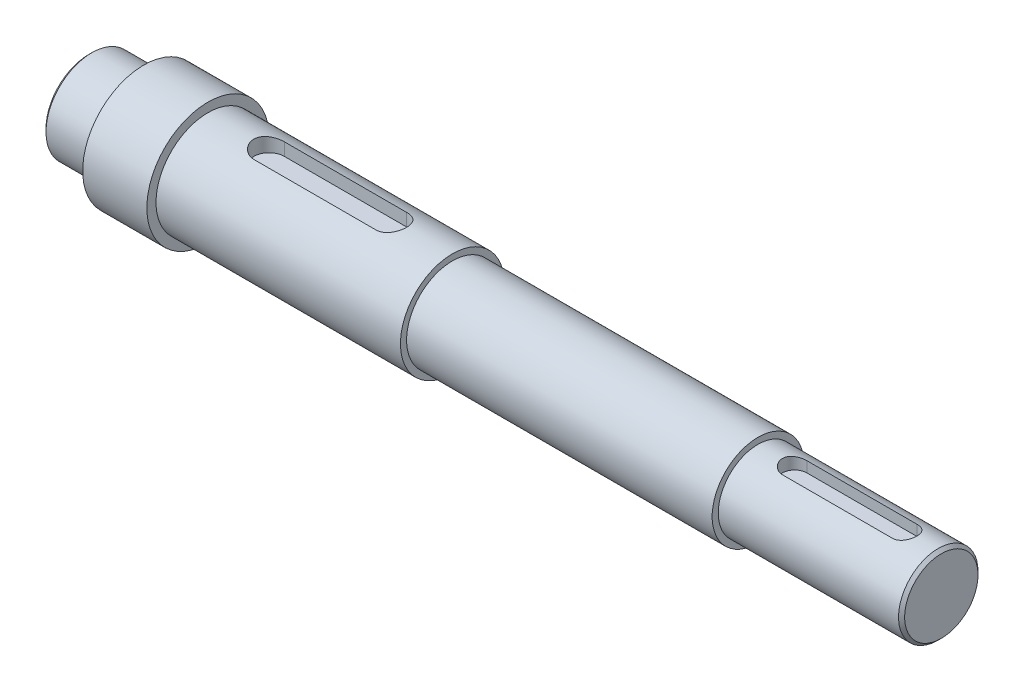
ISO-10303-21;
HEADER;
FILE_DESCRIPTION(('STEP AP214'),'2;1');
FILE_NAME('part.step','',(''),(''),'','','');
FILE_SCHEMA(('AUTOMOTIVE_DESIGN { 1 0 10303 214 1 1 1 1 }'));
ENDSEC;
DATA;
#1=APPLICATION_CONTEXT('core data for automotive mechanical design processes');
#2=APPLICATION_PROTOCOL_DEFINITION('international standard','automotive_design',2000,#1);
#3=PRODUCT_CONTEXT('',#1,'mechanical');
#4=PRODUCT('Part','Part','',(#3));
#5=PRODUCT_RELATED_PRODUCT_CATEGORY('part','',(#4));
#6=PRODUCT_DEFINITION_FORMATION('','',#4);
#7=PRODUCT_DEFINITION_CONTEXT('part definition',#1,'design');
#8=PRODUCT_DEFINITION('design','',#6,#7);
#9=PRODUCT_DEFINITION_SHAPE('','',#8);
#10=(LENGTH_UNIT() NAMED_UNIT(*) SI_UNIT(.MILLI.,.METRE.));
#11=(NAMED_UNIT(*) PLANE_ANGLE_UNIT() SI_UNIT($,.RADIAN.));
#12=(NAMED_UNIT(*) SI_UNIT($,.STERADIAN.) SOLID_ANGLE_UNIT());
#13=UNCERTAINTY_MEASURE_WITH_UNIT(LENGTH_MEASURE(1.E-05),#10,'distance_accuracy_value','');
#14=(GEOMETRIC_REPRESENTATION_CONTEXT(3) GLOBAL_UNCERTAINTY_ASSIGNED_CONTEXT((#13)) GLOBAL_UNIT_ASSIGNED_CONTEXT((#10,
#11,#12)) REPRESENTATION_CONTEXT('',''));
#15=CARTESIAN_POINT('',(0.,0.,0.));
#16=DIRECTION('',(0.,0.,1.));
#17=DIRECTION('',(1.,0.,0.));
#18=AXIS2_PLACEMENT_3D('',#15,#16,#17);
#19=CARTESIAN_POINT('',(-40.,0.,0.));
#20=DIRECTION('',(1.,0.,0.));
#21=DIRECTION('',(0.,0.,-1.));
#22=AXIS2_PLACEMENT_3D('',#19,#20,#21);
#23=CYLINDRICAL_SURFACE('',#22,17.);
#24=CARTESIAN_POINT('',(20.,16.2480768092719,4.99999999999999));
#25=CARTESIAN_POINT('',(20.1373573551922,16.2480576057113,5.00001833365599));
#26=CARTESIAN_POINT('',(20.2747075137782,16.2498179552306,4.99434067750169));
#27=CARTESIAN_POINT('',(20.5483622843304,16.2567574396778,4.97172956757708));
#28=CARTESIAN_POINT('',(20.6846671171852,16.2619358310066,4.9547985619809));
#29=CARTESIAN_POINT('',(20.954927984574,16.2755544258761,4.9098721345541));
#30=CARTESIAN_POINT('',(21.08888897085,16.2839865768408,4.88190402408557));
#31=CARTESIAN_POINT('',(21.35386058697,16.303848966742,4.81515607667776));
#32=CARTESIAN_POINT('',(21.4848711443316,16.3152792792465,4.77637597443613));
#33=CARTESIAN_POINT('',(21.7429838808258,16.3407928675336,4.68834546623764));
#34=CARTESIAN_POINT('',(21.8700881832774,16.35487467128,4.639100867945));
#35=CARTESIAN_POINT('',(22.1196497111169,16.3852842844182,4.53052243699424));
#36=CARTESIAN_POINT('',(22.2421051873766,16.4016129287079,4.47118485196363));
#37=CARTESIAN_POINT('',(22.6013177842668,16.4532935993227,4.27864731243666));
#38=CARTESIAN_POINT('',(22.8300782555896,16.4913567660558,4.13086866840748));
#39=CARTESIAN_POINT('',(23.2660976925366,16.571663624385,3.79609162419459));
#40=CARTESIAN_POINT('',(23.4725969054199,16.6139932162939,3.6081305850655));
#41=CARTESIAN_POINT('',(23.8516884654868,16.6973435357355,3.20030857492808));
#42=CARTESIAN_POINT('',(24.024275129355,16.738364042919,2.98044226771472));
#43=CARTESIAN_POINT('',(24.3338634908734,16.8154504865609,2.50968968461801));
#44=CARTESIAN_POINT('',(24.4700927618875,16.8514022123902,2.25827531326124));
#45=CARTESIAN_POINT('',(24.6980429387671,16.9132940292114,1.73487980523033));
#46=CARTESIAN_POINT('',(24.7897749729991,16.9392366230664,1.46290383051912));
#47=CARTESIAN_POINT('',(24.9236255034259,16.9775755314304,0.914050811145533));
#48=CARTESIAN_POINT('',(24.967041360291,16.9903253914832,0.637515280561356));
#49=CARTESIAN_POINT('',(25.0071261054816,17.002085771092,0.0808045490202934));
#50=CARTESIAN_POINT('',(25.0038034661687,17.0010987807491,-0.1993699830897));
#51=CARTESIAN_POINT('',(24.9513847320661,16.9857482177916,-0.746303613122903));
#52=CARTESIAN_POINT('',(24.9036937216598,16.971795274301,-1.01321077293713));
#53=CARTESIAN_POINT('',(24.7661741598714,16.9325753120472,-1.53505435338395));
#54=CARTESIAN_POINT('',(24.67634343216,16.9073077089352,-1.78999015500089));
#55=CARTESIAN_POINT('',(24.4561536556856,16.8477289854582,-2.28401372569565));
#56=CARTESIAN_POINT('',(24.3253453943821,16.8133183027333,-2.52288833489009));
#57=CARTESIAN_POINT('',(24.0271392111166,16.7390884536049,-2.97583887126396));
#58=CARTESIAN_POINT('',(23.8597334078597,16.6992681229319,-3.18990944166786));
#59=CARTESIAN_POINT('',(23.5812358030133,16.6378075752149,-3.4920659168818));
#60=CARTESIAN_POINT('',(23.4817831564547,16.6166346371931,-3.59122666935948));
#61=CARTESIAN_POINT('',(23.2748783834456,16.574515917753,-3.78085070777116));
#62=CARTESIAN_POINT('',(23.1674290232921,16.5535700606271,-3.87131697679482));
#63=CARTESIAN_POINT('',(22.945133981091,16.5124763694782,-4.04301012905334));
#64=CARTESIAN_POINT('',(22.8302833662414,16.4923290824383,-4.12423074837306));
#65=CARTESIAN_POINT('',(22.5940231238164,16.4534309011257,-4.27677509066324));
#66=CARTESIAN_POINT('',(22.4726160769662,16.4346794642359,-4.34810266882159));
#67=CARTESIAN_POINT('',(22.222763974027,16.3989403852824,-4.48102005705394));
#68=CARTESIAN_POINT('',(22.0942612508792,16.3819719919192,-4.5425067371777));
#69=CARTESIAN_POINT('',(21.8322669374845,16.3505443123856,-4.65436101170345));
#70=CARTESIAN_POINT('',(21.6987774077231,16.3360840035426,-4.70473314035983));
#71=CARTESIAN_POINT('',(21.427861366181,16.3101389019193,-4.79390518315269));
#72=CARTESIAN_POINT('',(21.290439153234,16.2986509883397,-4.83271724105078));
#73=CARTESIAN_POINT('',(21.0126074426436,16.2790104320994,-4.89846852342729));
#74=CARTESIAN_POINT('',(20.872199356913,16.2708562483744,-4.9254132342024));
#75=CARTESIAN_POINT('',(20.6098794624432,16.2590705066644,-4.96417068240111));
#76=CARTESIAN_POINT('',(20.488226619312,16.2549556983354,-4.97760735163162));
#77=CARTESIAN_POINT('',(20.2443856622037,16.2494550949357,-4.99552050263312));
#78=CARTESIAN_POINT('',(20.1221986228068,16.2480652217765,-5.00001037418403));
#79=CARTESIAN_POINT('',(20.,16.2480768092719,-5.00000000000001));
#80=B_SPLINE_CURVE_WITH_KNOTS('',3,(#24,#25,#26,#27,#28,#29,#30,#31,#32,#33,#34,#35,#36,#37,#38,
#39,#40,#41,#42,#43,#44,#45,#46,#47,#48,#49,#50,#51,#52,#53,#54,#55,#56,#57,#58,#59,#60,#61,#62,
#63,#64,#65,#66,#67,#68,#69,#70,#71,#72,#73,#74,#75,#76,#77,#78,#79),.UNSPECIFIED.,.F.,.F.,(4,2,
2,2,2,2,2,2,2,2,2,2,2,2,2,2,2,2,2,2,2,2,2,2,2,2,2,4),(0.,0.411932308607318,0.823775030369109,
1.23460497227756,1.6454449959308,2.05605760124987,2.4668231992094,3.28785949768654,
4.13136486159802,4.97501146602548,5.8353659212397,6.69550509831942,7.53194488257935,
8.36823304602236,9.17890704625409,9.98962291880722,10.8095570219776,11.6296678725158,
12.0553444367381,12.4808744253904,12.9066910154504,13.3323412013584,13.762195215061,
14.1918735414273,14.6210988891539,15.0501255963828,15.4171594657276,15.7836436182818),.UNSPECIFIED.);
#81=CARTESIAN_POINT('',(20.,16.2480768092719,4.99999999999999));
#82=VERTEX_POINT('',#81);
#83=CARTESIAN_POINT('',(20.,16.2480768092719,-5.00000000000001));
#84=VERTEX_POINT('',#83);
#85=EDGE_CURVE('E181',#82,#84,#80,.T.);
#86=ORIENTED_EDGE('',*,*,#85,.F.);
#87=DIRECTION('',(1.,0.,0.));
#88=VECTOR('',#87,1.);
#89=CARTESIAN_POINT('',(-40.,16.2480768092719,5.));
#90=LINE('',#89,#88);
#91=CARTESIAN_POINT('',(-20.,16.2480768092719,5.));
#92=VERTEX_POINT('',#91);
#93=EDGE_CURVE('E149',#92,#82,#90,.T.);
#94=ORIENTED_EDGE('',*,*,#93,.F.);
#95=CARTESIAN_POINT('',(-20.,16.2480768092719,-5.));
#96=CARTESIAN_POINT('',(-20.1373573551922,16.2480576057113,-5.00001833365599));
#97=CARTESIAN_POINT('',(-20.2747075137782,16.2498179552306,-4.9943406775017));
#98=CARTESIAN_POINT('',(-20.5483622843304,16.2567574396778,-4.97172956757709));
#99=CARTESIAN_POINT('',(-20.6846671171852,16.2619358310066,-4.95479856198091));
#100=CARTESIAN_POINT('',(-20.954927984574,16.2755544258761,-4.9098721345541));
#101=CARTESIAN_POINT('',(-21.08888897085,16.2839865768408,-4.88190402408558));
#102=CARTESIAN_POINT('',(-21.35386058697,16.303848966742,-4.81515607667777));
#103=CARTESIAN_POINT('',(-21.4848711443316,16.3152792792465,-4.77637597443613));
#104=CARTESIAN_POINT('',(-21.7429838808258,16.3407928675336,-4.68834546623764));
#105=CARTESIAN_POINT('',(-21.8700881832774,16.35487467128,-4.63910086794501));
#106=CARTESIAN_POINT('',(-22.1196497111169,16.3852842844182,-4.53052243699425));
#107=CARTESIAN_POINT('',(-22.2421051873766,16.4016129287079,-4.47118485196364));
#108=CARTESIAN_POINT('',(-22.6013177842668,16.4532935993227,-4.27864731243667));
#109=CARTESIAN_POINT('',(-22.8300782555896,16.4913567660558,-4.13086866840748));
#110=CARTESIAN_POINT('',(-23.2660976925366,16.571663624385,-3.7960916241946));
#111=CARTESIAN_POINT('',(-23.4725969054199,16.6139932162939,-3.60813058506551));
#112=CARTESIAN_POINT('',(-23.8516884654868,16.6973435357355,-3.20030857492808));
#113=CARTESIAN_POINT('',(-24.0242751293551,16.738364042919,-2.98044226771472));
#114=CARTESIAN_POINT('',(-24.3338634908734,16.8154504865609,-2.50968968461802));
#115=CARTESIAN_POINT('',(-24.4700927618875,16.8514022123902,-2.25827531326124));
#116=CARTESIAN_POINT('',(-24.6980429387671,16.9132940292114,-1.73487980523033));
#117=CARTESIAN_POINT('',(-24.7897749729991,16.9392366230664,-1.46290383051912));
#118=CARTESIAN_POINT('',(-24.9236255034259,16.9775755314304,-0.914050811145538));
#119=CARTESIAN_POINT('',(-24.967041360291,16.9903253914832,-0.637515280561361));
#120=CARTESIAN_POINT('',(-25.0071261054816,17.002085771092,-0.0808045490202978));
#121=CARTESIAN_POINT('',(-25.0038034661687,17.0010987807491,0.199369983089696));
#122=CARTESIAN_POINT('',(-24.9513847320661,16.9857482177916,0.746303613122898));
#123=CARTESIAN_POINT('',(-24.9036937216598,16.971795274301,1.01321077293712));
#124=CARTESIAN_POINT('',(-24.7661741598714,16.9325753120472,1.53505435338394));
#125=CARTESIAN_POINT('',(-24.67634343216,16.9073077089352,1.78999015500089));
#126=CARTESIAN_POINT('',(-24.4561536556856,16.8477289854582,2.28401372569564));
#127=CARTESIAN_POINT('',(-24.3253453943821,16.8133183027333,2.52288833489009));
#128=CARTESIAN_POINT('',(-24.0271392111166,16.7390884536049,2.97583887126396));
#129=CARTESIAN_POINT('',(-23.8597334078597,16.6992681229319,3.18990944166786));
#130=CARTESIAN_POINT('',(-23.5812358030132,16.6378075752149,3.49206591688179));
#131=CARTESIAN_POINT('',(-23.4817831564547,16.6166346371931,3.59122666935947));
#132=CARTESIAN_POINT('',(-23.2748783834456,16.574515917753,3.78085070777115));
#133=CARTESIAN_POINT('',(-23.1674290232921,16.5535700606271,3.87131697679481));
#134=CARTESIAN_POINT('',(-22.945133981091,16.5124763694782,4.04301012905334));
#135=CARTESIAN_POINT('',(-22.8302833662414,16.4923290824383,4.12423074837306));
#136=CARTESIAN_POINT('',(-22.5940231238164,16.4534309011257,4.27677509066323));
#137=CARTESIAN_POINT('',(-22.4726160769662,16.4346794642359,4.34810266882159));
#138=CARTESIAN_POINT('',(-22.222763974027,16.3989403852824,4.48102005705394));
#139=CARTESIAN_POINT('',(-22.0942612508792,16.3819719919192,4.54250673717769));
#140=CARTESIAN_POINT('',(-21.8322669374845,16.3505443123856,4.65436101170344));
#141=CARTESIAN_POINT('',(-21.6987774077231,16.3360840035426,4.70473314035982));
#142=CARTESIAN_POINT('',(-21.427861366181,16.3101389019193,4.79390518315268));
#143=CARTESIAN_POINT('',(-21.290439153234,16.2986509883397,4.83271724105077));
#144=CARTESIAN_POINT('',(-21.0126074426436,16.2790104320994,4.89846852342728));
#145=CARTESIAN_POINT('',(-20.872199356913,16.2708562483745,4.92541323420239));
#146=CARTESIAN_POINT('',(-20.6098794624432,16.2590705066644,4.9641706824011));
#147=CARTESIAN_POINT('',(-20.488226619312,16.2549556983354,4.97760735163161));
#148=CARTESIAN_POINT('',(-20.2443856622037,16.2494550949357,4.99552050263311));
#149=CARTESIAN_POINT('',(-20.1221986228068,16.2480652217765,5.00001037418402));
#150=CARTESIAN_POINT('',(-20.,16.2480768092719,5.));
#151=B_SPLINE_CURVE_WITH_KNOTS('',3,(#95,#96,#97,#98,#99,#100,#101,#102,#103,#104,#105,#106,
#107,#108,#109,#110,#111,#112,#113,#114,#115,#116,#117,#118,#119,#120,#121,#122,#123,#124,#125,
#126,#127,#128,#129,#130,#131,#132,#133,#134,#135,#136,#137,#138,#139,#140,#141,#142,#143,#144,
#145,#146,#147,#148,#149,#150),.UNSPECIFIED.,.F.,.F.,(4,2,2,2,2,2,2,2,2,2,2,2,2,2,2,2,2,2,2,2,2,
2,2,2,2,2,2,4),(0.,0.411932308607318,0.82377503036911,1.23460497227756,1.6454449959308,
2.05605760124987,2.4668231992094,3.28785949768654,4.13136486159803,4.97501146602548,
5.8353659212397,6.69550509831943,7.53194488257935,8.36823304602237,9.17890704625409,
9.98962291880722,10.8095570219776,11.6296678725158,12.0553444367381,12.4808744253904,
12.9066910154504,13.3323412013584,13.762195215061,14.1918735414273,14.6210988891539,
15.0501255963828,15.4171594657276,15.7836436182818),.UNSPECIFIED.);
#152=CARTESIAN_POINT('',(-20.,16.2480768092719,-5.));
#153=VERTEX_POINT('',#152);
#154=EDGE_CURVE('E212',#153,#92,#151,.T.);
#155=ORIENTED_EDGE('',*,*,#154,.F.);
#156=DIRECTION('',(1.,0.,0.));
#157=VECTOR('',#156,1.);
#158=CARTESIAN_POINT('',(-40.,16.2480768092719,-5.));
#159=LINE('',#158,#157);
#160=EDGE_CURVE('E191',#84,#153,#159,.F.);
#161=ORIENTED_EDGE('',*,*,#160,.F.);
#162=EDGE_LOOP('',(#86,#94,#155,#161));
#163=FACE_BOUND('',#162,.T.);
#164=CARTESIAN_POINT('',(-40.,0.,0.));
#165=DIRECTION('',(1.,0.,0.));
#166=DIRECTION('',(0.,0.,-1.));
#167=AXIS2_PLACEMENT_3D('',#164,#165,#166);
#168=CIRCLE('',#167,17.);
#169=CARTESIAN_POINT('',(-40.,0.,-17.));
#170=VERTEX_POINT('',#169);
#171=EDGE_CURVE('E153',#170,#170,#168,.T.);
#172=ORIENTED_EDGE('',*,*,#171,.T.);
#173=EDGE_LOOP('',(#172));
#174=FACE_BOUND('',#173,.T.);
#175=CARTESIAN_POINT('',(40.,0.,0.));
#176=DIRECTION('',(1.,0.,0.));
#177=DIRECTION('',(0.,0.,-1.));
#178=AXIS2_PLACEMENT_3D('',#175,#176,#177);
#179=CIRCLE('',#178,17.);
#180=CARTESIAN_POINT('',(40.,0.,-17.));
#181=VERTEX_POINT('',#180);
#182=EDGE_CURVE('E171',#181,#181,#179,.T.);
#183=ORIENTED_EDGE('',*,*,#182,.F.);
#184=EDGE_LOOP('',(#183));
#185=FACE_BOUND('',#184,.T.);
#186=ADVANCED_FACE('F36',(#163,#174,#185),#23,.T.);
#187=CARTESIAN_POINT('',(40.,0.,0.));
#188=DIRECTION('',(1.,0.,0.));
#189=DIRECTION('',(0.,0.,-1.));
#190=AXIS2_PLACEMENT_3D('',#187,#188,#189);
#191=PLANE('',#190);
#192=CARTESIAN_POINT('',(40.,0.,0.));
#193=DIRECTION('',(1.,0.,0.));
#194=DIRECTION('',(0.,0.,-1.));
#195=AXIS2_PLACEMENT_3D('',#192,#193,#194);
#196=CIRCLE('',#195,15.);
#197=CARTESIAN_POINT('',(40.,0.,-15.));
#198=VERTEX_POINT('',#197);
#199=EDGE_CURVE('E138',#198,#198,#196,.T.);
#200=ORIENTED_EDGE('',*,*,#199,.F.);
#201=EDGE_LOOP('',(#200));
#202=FACE_BOUND('',#201,.T.);
#203=ORIENTED_EDGE('',*,*,#182,.T.);
#204=EDGE_LOOP('',(#203));
#205=FACE_BOUND('',#204,.T.);
#206=ADVANCED_FACE('F210',(#202,#205),#191,.T.);
#207=CARTESIAN_POINT('',(-20.,12.1,0.));
#208=DIRECTION('',(0.,1.,0.));
#209=DIRECTION('',(0.,0.,1.));
#210=AXIS2_PLACEMENT_3D('',#207,#208,#209);
#211=CYLINDRICAL_SURFACE('',#210,5.);
#212=DIRECTION('',(0.,1.,0.));
#213=VECTOR('',#212,1.);
#214=CARTESIAN_POINT('',(-20.,12.1,-5.));
#215=LINE('',#214,#213);
#216=CARTESIAN_POINT('',(-20.,12.1,-5.));
#217=VERTEX_POINT('',#216);
#218=EDGE_CURVE('E168',#217,#153,#215,.T.);
#219=ORIENTED_EDGE('',*,*,#218,.T.);
#220=ORIENTED_EDGE('',*,*,#154,.T.);
#221=DIRECTION('',(0.,1.,0.));
#222=VECTOR('',#221,1.);
#223=CARTESIAN_POINT('',(-20.,12.1,5.));
#224=LINE('',#223,#222);
#225=CARTESIAN_POINT('',(-20.,12.1,5.));
#226=VERTEX_POINT('',#225);
#227=EDGE_CURVE('E59',#226,#92,#224,.T.);
#228=ORIENTED_EDGE('',*,*,#227,.F.);
#229=CARTESIAN_POINT('',(-20.,12.1,0.));
#230=DIRECTION('',(0.,1.,0.));
#231=DIRECTION('',(0.,0.,1.));
#232=AXIS2_PLACEMENT_3D('',#229,#230,#231);
#233=CIRCLE('',#232,5.);
#234=EDGE_CURVE('E156',#217,#226,#233,.T.);
#235=ORIENTED_EDGE('',*,*,#234,.F.);
#236=EDGE_LOOP('',(#219,#220,#228,#235));
#237=FACE_BOUND('',#236,.T.);
#238=ADVANCED_FACE('F207',(#237),#211,.F.);
#239=CARTESIAN_POINT('',(-20.,12.1,-5.));
#240=DIRECTION('',(0.,0.,-1.));
#241=DIRECTION('',(-1.,0.,0.));
#242=AXIS2_PLACEMENT_3D('',#239,#240,#241);
#243=PLANE('',#242);
#244=ORIENTED_EDGE('',*,*,#160,.T.);
#245=ORIENTED_EDGE('',*,*,#218,.F.);
#246=DIRECTION('',(-1.,0.,0.));
#247=VECTOR('',#246,1.);
#248=CARTESIAN_POINT('',(-20.,12.1,-5.));
#249=LINE('',#248,#247);
#250=CARTESIAN_POINT('',(20.,12.1,-5.00000000000001));
#251=VERTEX_POINT('',#250);
#252=EDGE_CURVE('E165',#251,#217,#249,.T.);
#253=ORIENTED_EDGE('',*,*,#252,.F.);
#254=DIRECTION('',(0.,1.,0.));
#255=VECTOR('',#254,1.);
#256=CARTESIAN_POINT('',(20.,12.1,-5.00000000000001));
#257=LINE('',#256,#255);
#258=EDGE_CURVE('E172',#251,#84,#257,.T.);
#259=ORIENTED_EDGE('',*,*,#258,.T.);
#260=EDGE_LOOP('',(#244,#245,#253,#259));
#261=FACE_BOUND('',#260,.T.);
#262=ADVANCED_FACE('F201',(#261),#243,.F.);
#263=CARTESIAN_POINT('',(20.,12.1,0.));
#264=DIRECTION('',(0.,1.,0.));
#265=DIRECTION('',(0.,0.,1.));
#266=AXIS2_PLACEMENT_3D('',#263,#264,#265);
#267=CYLINDRICAL_SURFACE('',#266,5.);
#268=DIRECTION('',(0.,1.,0.));
#269=VECTOR('',#268,1.);
#270=CARTESIAN_POINT('',(20.,12.1,4.99999999999999));
#271=LINE('',#270,#269);
#272=CARTESIAN_POINT('',(20.,12.1,4.99999999999999));
#273=VERTEX_POINT('',#272);
#274=EDGE_CURVE('E175',#273,#82,#271,.T.);
#275=ORIENTED_EDGE('',*,*,#274,.T.);
#276=ORIENTED_EDGE('',*,*,#85,.T.);
#277=ORIENTED_EDGE('',*,*,#258,.F.);
#278=CARTESIAN_POINT('',(20.,12.1,0.));
#279=DIRECTION('',(0.,1.,0.));
#280=DIRECTION('',(0.,0.,1.));
#281=AXIS2_PLACEMENT_3D('',#278,#279,#280);
#282=CIRCLE('',#281,5.);
#283=EDGE_CURVE('E162',#273,#251,#282,.T.);
#284=ORIENTED_EDGE('',*,*,#283,.F.);
#285=EDGE_LOOP('',(#275,#276,#277,#284));
#286=FACE_BOUND('',#285,.T.);
#287=ADVANCED_FACE('F195',(#286),#267,.F.);
#288=CARTESIAN_POINT('',(-20.,12.1,5.));
#289=DIRECTION('',(0.,0.,1.));
#290=DIRECTION('',(1.,0.,0.));
#291=AXIS2_PLACEMENT_3D('',#288,#289,#290);
#292=PLANE('',#291);
#293=ORIENTED_EDGE('',*,*,#93,.T.);
#294=ORIENTED_EDGE('',*,*,#274,.F.);
#295=DIRECTION('',(1.,0.,0.));
#296=VECTOR('',#295,1.);
#297=CARTESIAN_POINT('',(-20.,12.1,5.));
#298=LINE('',#297,#296);
#299=EDGE_CURVE('E159',#226,#273,#298,.T.);
#300=ORIENTED_EDGE('',*,*,#299,.F.);
#301=ORIENTED_EDGE('',*,*,#227,.T.);
#302=EDGE_LOOP('',(#293,#294,#300,#301));
#303=FACE_BOUND('',#302,.T.);
#304=ADVANCED_FACE('F200',(#303),#292,.F.);
#305=CARTESIAN_POINT('',(-20.,12.1,0.));
#306=DIRECTION('',(0.,1.,0.));
#307=DIRECTION('',(0.,0.,1.));
#308=AXIS2_PLACEMENT_3D('',#305,#306,#307);
#309=PLANE('',#308);
#310=ORIENTED_EDGE('',*,*,#234,.T.);
#311=ORIENTED_EDGE('',*,*,#299,.T.);
#312=ORIENTED_EDGE('',*,*,#283,.T.);
#313=ORIENTED_EDGE('',*,*,#252,.T.);
#314=EDGE_LOOP('',(#310,#311,#312,#313));
#315=FACE_BOUND('',#314,.T.);
#316=ADVANCED_FACE('F206',(#315),#309,.T.);
#317=CARTESIAN_POINT('',(-61.,0.,0.));
#318=DIRECTION('',(1.,0.,0.));
#319=DIRECTION('',(0.,0.,-1.));
#320=AXIS2_PLACEMENT_3D('',#317,#318,#319);
#321=CYLINDRICAL_SURFACE('',#320,20.);
#322=CARTESIAN_POINT('',(-61.,0.,0.));
#323=DIRECTION('',(-1.,0.,0.));
#324=DIRECTION('',(0.,0.,1.));
#325=AXIS2_PLACEMENT_3D('',#322,#323,#324);
#326=CIRCLE('',#325,20.);
#327=CARTESIAN_POINT('',(-61.,0.,-20.));
#328=VERTEX_POINT('',#327);
#329=EDGE_CURVE('E150',#328,#328,#326,.T.);
#330=CARTESIAN_POINT('',(-40.,0.,0.));
#331=DIRECTION('',(-1.,0.,0.));
#332=DIRECTION('',(0.,0.,1.));
#333=AXIS2_PLACEMENT_3D('',#330,#331,#332);
#334=CIRCLE('',#333,20.);
#335=CARTESIAN_POINT('',(-40.,0.,-20.));
#336=VERTEX_POINT('',#335);
#337=EDGE_CURVE('E141',#336,#336,#334,.T.);
#338=CARTESIAN_POINT('',(-61.,0.,-20.));
#339=CARTESIAN_POINT('',(-60.78125,0.,-20.));
#340=CARTESIAN_POINT('',(-60.5625,0.,-20.));
#341=CARTESIAN_POINT('',(-60.125,0.,-20.));
#342=CARTESIAN_POINT('',(-59.90625,0.,-20.));
#343=CARTESIAN_POINT('',(-59.46875,0.,-20.));
#344=CARTESIAN_POINT('',(-59.25,0.,-20.));
#345=CARTESIAN_POINT('',(-58.8125,0.,-20.));
#346=CARTESIAN_POINT('',(-58.59375,0.,-20.));
#347=CARTESIAN_POINT('',(-58.15625,0.,-20.));
#348=CARTESIAN_POINT('',(-57.9375,0.,-20.));
#349=CARTESIAN_POINT('',(-57.5,0.,-20.));
#350=CARTESIAN_POINT('',(-57.28125,0.,-20.));
#351=CARTESIAN_POINT('',(-56.84375,0.,-20.));
#352=CARTESIAN_POINT('',(-56.625,0.,-20.));
#353=CARTESIAN_POINT('',(-56.1875,0.,-20.));
#354=CARTESIAN_POINT('',(-55.96875,0.,-20.));
#355=CARTESIAN_POINT('',(-55.53125,0.,-20.));
#356=CARTESIAN_POINT('',(-55.3125,0.,-20.));
#357=CARTESIAN_POINT('',(-54.875,0.,-20.));
#358=CARTESIAN_POINT('',(-54.65625,0.,-20.));
#359=CARTESIAN_POINT('',(-54.21875,0.,-20.));
#360=CARTESIAN_POINT('',(-54.,0.,-20.));
#361=CARTESIAN_POINT('',(-53.5625,0.,-20.));
#362=CARTESIAN_POINT('',(-53.34375,0.,-20.));
#363=CARTESIAN_POINT('',(-52.90625,0.,-20.));
#364=CARTESIAN_POINT('',(-52.6875,0.,-20.));
#365=CARTESIAN_POINT('',(-52.25,0.,-20.));
#366=CARTESIAN_POINT('',(-52.03125,0.,-20.));
#367=CARTESIAN_POINT('',(-51.59375,0.,-20.));
#368=CARTESIAN_POINT('',(-51.375,0.,-20.));
#369=CARTESIAN_POINT('',(-50.9375,0.,-20.));
#370=CARTESIAN_POINT('',(-50.71875,0.,-20.));
#371=CARTESIAN_POINT('',(-50.28125,0.,-20.));
#372=CARTESIAN_POINT('',(-50.0625,0.,-20.));
#373=CARTESIAN_POINT('',(-49.625,0.,-20.));
#374=CARTESIAN_POINT('',(-49.40625,0.,-20.));
#375=CARTESIAN_POINT('',(-48.96875,0.,-20.));
#376=CARTESIAN_POINT('',(-48.75,0.,-20.));
#377=CARTESIAN_POINT('',(-48.3125,0.,-20.));
#378=CARTESIAN_POINT('',(-48.09375,0.,-20.));
#379=CARTESIAN_POINT('',(-47.65625,0.,-20.));
#380=CARTESIAN_POINT('',(-47.4375,0.,-20.));
#381=CARTESIAN_POINT('',(-47.,0.,-20.));
#382=CARTESIAN_POINT('',(-46.78125,0.,-20.));
#383=CARTESIAN_POINT('',(-46.34375,0.,-20.));
#384=CARTESIAN_POINT('',(-46.125,0.,-20.));
#385=CARTESIAN_POINT('',(-45.6875,0.,-20.));
#386=CARTESIAN_POINT('',(-45.46875,0.,-20.));
#387=CARTESIAN_POINT('',(-45.03125,0.,-20.));
#388=CARTESIAN_POINT('',(-44.8125,0.,-20.));
#389=CARTESIAN_POINT('',(-44.375,0.,-20.));
#390=CARTESIAN_POINT('',(-44.15625,0.,-20.));
#391=CARTESIAN_POINT('',(-43.71875,0.,-20.));
#392=CARTESIAN_POINT('',(-43.5,0.,-20.));
#393=CARTESIAN_POINT('',(-43.0625,0.,-20.));
#394=CARTESIAN_POINT('',(-42.84375,0.,-20.));
#395=CARTESIAN_POINT('',(-42.40625,0.,-20.));
#396=CARTESIAN_POINT('',(-42.1875,0.,-20.));
#397=CARTESIAN_POINT('',(-41.75,0.,-20.));
#398=CARTESIAN_POINT('',(-41.53125,0.,-20.));
#399=CARTESIAN_POINT('',(-41.09375,0.,-20.));
#400=CARTESIAN_POINT('',(-40.875,0.,-20.));
#401=CARTESIAN_POINT('',(-40.4375,0.,-20.));
#402=CARTESIAN_POINT('',(-40.21875,0.,-20.));
#403=CARTESIAN_POINT('',(-40.,0.,-20.));
#404=B_SPLINE_CURVE_WITH_KNOTS('',3,(#338,#339,#340,#341,#342,#343,#344,#345,#346,#347,#348,
#349,#350,#351,#352,#353,#354,#355,#356,#357,#358,#359,#360,#361,#362,#363,#364,#365,#366,#367,
#368,#369,#370,#371,#372,#373,#374,#375,#376,#377,#378,#379,#380,#381,#382,#383,#384,#385,#386,
#387,#388,#389,#390,#391,#392,#393,#394,#395,#396,#397,#398,#399,#400,#401,#402,#403),
.UNSPECIFIED.,.F.,.F.,(4,2,2,2,2,2,2,2,2,2,2,2,2,2,2,2,2,2,2,2,2,2,2,2,2,2,2,2,2,2,2,2,4),(0.,
0.656250000000004,1.3125,1.96875000000001,2.625,3.28125000000001,3.9375,4.59375,5.25,5.90625,
6.56250000000001,7.21875,7.875,8.53125,9.1875,9.84375,10.5,11.15625,11.8125,12.46875,13.125,
13.78125,14.4375,15.09375,15.75,16.40625,17.0625,17.71875,18.375,19.03125,19.6875,20.34375,21.),.UNSPECIFIED.);
#405=EDGE_CURVE('BSEAM283',#328,#336,#404,.T.);
#406=ORIENTED_EDGE('',*,*,#329,.F.);
#407=ORIENTED_EDGE('',*,*,#337,.T.);
#408=ORIENTED_EDGE('',*,*,#405,.T.);
#409=ORIENTED_EDGE('',*,*,#405,.F.);
#410=EDGE_LOOP('',(#406,#408,#407,#409));
#411=FACE_BOUND('',#410,.T.);
#412=ADVANCED_FACE('F283',(#411),#321,.T.);
#413=CARTESIAN_POINT('',(-61.,0.,0.));
#414=DIRECTION('',(-1.,0.,0.));
#415=DIRECTION('',(0.,0.,1.));
#416=AXIS2_PLACEMENT_3D('',#413,#414,#415);
#417=PLANE('',#416);
#418=CARTESIAN_POINT('',(-61.,0.,0.));
#419=DIRECTION('',(-1.,0.,0.));
#420=DIRECTION('',(0.,0.,1.));
#421=AXIS2_PLACEMENT_3D('',#418,#419,#420);
#422=CIRCLE('',#421,15.);
#423=CARTESIAN_POINT('',(-61.,0.,15.));
#424=VERTEX_POINT('',#423);
#425=EDGE_CURVE('E145',#424,#424,#422,.T.);
#426=ORIENTED_EDGE('',*,*,#425,.F.);
#427=EDGE_LOOP('',(#426));
#428=FACE_BOUND('',#427,.T.);
#429=ORIENTED_EDGE('',*,*,#329,.T.);
#430=EDGE_LOOP('',(#429));
#431=FACE_BOUND('',#430,.T.);
#432=ADVANCED_FACE('F279',(#428,#431),#417,.T.);
#433=CARTESIAN_POINT('',(-40.,0.,0.));
#434=DIRECTION('',(-1.,0.,0.));
#435=DIRECTION('',(0.,0.,1.));
#436=AXIS2_PLACEMENT_3D('',#433,#434,#435);
#437=PLANE('',#436);
#438=ORIENTED_EDGE('',*,*,#171,.F.);
#439=EDGE_LOOP('',(#438));
#440=FACE_BOUND('',#439,.T.);
#441=ORIENTED_EDGE('',*,*,#337,.F.);
#442=EDGE_LOOP('',(#441));
#443=FACE_BOUND('',#442,.T.);
#444=ADVANCED_FACE('F275',(#440,#443),#437,.F.);
#445=CARTESIAN_POINT('',(-79.,0.,0.));
#446=DIRECTION('',(1.,0.,0.));
#447=DIRECTION('',(0.,0.,-1.));
#448=AXIS2_PLACEMENT_3D('',#445,#446,#447);
#449=CYLINDRICAL_SURFACE('',#448,15.);
#450=CARTESIAN_POINT('',(-78.,0.,0.));
#451=DIRECTION('',(-1.,0.,0.));
#452=DIRECTION('',(0.,0.,1.));
#453=AXIS2_PLACEMENT_3D('',#450,#451,#452);
#454=CIRCLE('',#453,15.);
#455=CARTESIAN_POINT('',(-78.,0.,15.));
#456=VERTEX_POINT('',#455);
#457=EDGE_CURVE('E144',#456,#456,#454,.F.);
#458=ORIENTED_EDGE('',*,*,#457,.T.);
#459=EDGE_LOOP('',(#458));
#460=FACE_BOUND('',#459,.T.);
#461=ORIENTED_EDGE('',*,*,#425,.T.);
#462=EDGE_LOOP('',(#461));
#463=FACE_BOUND('',#462,.T.);
#464=ADVANCED_FACE('F278',(#460,#463),#449,.T.);
#465=CARTESIAN_POINT('',(-79.,0.,0.));
#466=DIRECTION('',(-1.,0.,0.));
#467=DIRECTION('',(0.,0.,1.));
#468=AXIS2_PLACEMENT_3D('',#465,#466,#467);
#469=PLANE('',#468);
#470=CARTESIAN_POINT('',(-79.,0.,0.));
#471=DIRECTION('',(-1.,0.,0.));
#472=DIRECTION('',(0.,0.,1.));
#473=AXIS2_PLACEMENT_3D('',#470,#471,#472);
#474=CIRCLE('',#473,14.);
#475=CARTESIAN_POINT('',(-79.,0.,14.));
#476=VERTEX_POINT('',#475);
#477=EDGE_CURVE('E148',#476,#476,#474,.T.);
#478=ORIENTED_EDGE('',*,*,#477,.T.);
#479=EDGE_LOOP('',(#478));
#480=FACE_BOUND('',#479,.T.);
#481=ADVANCED_FACE('F298',(#480),#469,.T.);
#482=CARTESIAN_POINT('',(-79.,0.,0.));
#483=DIRECTION('',(1.,0.,0.));
#484=DIRECTION('',(0.,0.,-1.));
#485=AXIS2_PLACEMENT_3D('',#482,#483,#484);
#486=CONICAL_SURFACE('',#485,14.,0.785398163397442);
#487=ORIENTED_EDGE('',*,*,#457,.F.);
#488=EDGE_LOOP('',(#487));
#489=FACE_BOUND('',#488,.T.);
#490=ORIENTED_EDGE('',*,*,#477,.F.);
#491=EDGE_LOOP('',(#490));
#492=FACE_BOUND('',#491,.T.);
#493=ADVANCED_FACE('F302',(#489,#492),#486,.T.);
#494=CARTESIAN_POINT('',(140.,0.,0.));
#495=DIRECTION('',(-1.,0.,0.));
#496=DIRECTION('',(0.,0.,1.));
#497=AXIS2_PLACEMENT_3D('',#494,#495,#496);
#498=CYLINDRICAL_SURFACE('',#497,15.);
#499=CARTESIAN_POINT('',(140.,0.,0.));
#500=DIRECTION('',(1.,0.,0.));
#501=DIRECTION('',(0.,0.,-1.));
#502=AXIS2_PLACEMENT_3D('',#499,#500,#501);
#503=CIRCLE('',#502,15.);
#504=CARTESIAN_POINT('',(140.,0.,-15.));
#505=VERTEX_POINT('',#504);
#506=EDGE_CURVE('E129',#505,#505,#503,.T.);
#507=ORIENTED_EDGE('',*,*,#506,.F.);
#508=EDGE_LOOP('',(#507));
#509=FACE_BOUND('',#508,.T.);
#510=ORIENTED_EDGE('',*,*,#199,.T.);
#511=EDGE_LOOP('',(#510));
#512=FACE_BOUND('',#511,.T.);
#513=ADVANCED_FACE('F304',(#509,#512),#498,.T.);
#514=CARTESIAN_POINT('',(140.,0.,0.));
#515=DIRECTION('',(1.,0.,0.));
#516=DIRECTION('',(0.,0.,-1.));
#517=AXIS2_PLACEMENT_3D('',#514,#515,#516);
#518=PLANE('',#517);
#519=CARTESIAN_POINT('',(140.,0.,0.));
#520=DIRECTION('',(1.,0.,0.));
#521=DIRECTION('',(0.,0.,-1.));
#522=AXIS2_PLACEMENT_3D('',#519,#520,#521);
#523=CIRCLE('',#522,13.);
#524=CARTESIAN_POINT('',(140.,0.,-13.));
#525=VERTEX_POINT('',#524);
#526=EDGE_CURVE('E134',#525,#525,#523,.T.);
#527=ORIENTED_EDGE('',*,*,#526,.F.);
#528=EDGE_LOOP('',(#527));
#529=FACE_BOUND('',#528,.T.);
#530=ORIENTED_EDGE('',*,*,#506,.T.);
#531=EDGE_LOOP('',(#530));
#532=FACE_BOUND('',#531,.T.);
#533=ADVANCED_FACE('F258',(#529,#532),#518,.T.);
#534=CARTESIAN_POINT('',(200.,0.,0.));
#535=DIRECTION('',(-1.,0.,0.));
#536=DIRECTION('',(0.,0.,1.));
#537=AXIS2_PLACEMENT_3D('',#534,#535,#536);
#538=CYLINDRICAL_SURFACE('',#537,13.);
#539=CARTESIAN_POINT('',(199.,0.,0.));
#540=DIRECTION('',(1.,0.,0.));
#541=DIRECTION('',(0.,0.,-1.));
#542=AXIS2_PLACEMENT_3D('',#539,#540,#541);
#543=CIRCLE('',#542,13.);
#544=CARTESIAN_POINT('',(199.,0.,-13.));
#545=VERTEX_POINT('',#544);
#546=EDGE_CURVE('E11',#545,#545,#543,.F.);
#547=ORIENTED_EDGE('',*,*,#546,.T.);
#548=EDGE_LOOP('',(#547));
#549=FACE_BOUND('',#548,.T.);
#550=DIRECTION('',(-1.,0.,0.));
#551=VECTOR('',#550,1.);
#552=CARTESIAN_POINT('',(200.,12.369316876853,-4.00000000000001));
#553=LINE('',#552,#551);
#554=CARTESIAN_POINT('',(152.,12.369316876853,-4.));
#555=VERTEX_POINT('',#554);
#556=CARTESIAN_POINT('',(188.,12.369316876853,-4.));
#557=VERTEX_POINT('',#556);
#558=EDGE_CURVE('E374',#555,#557,#553,.F.);
#559=ORIENTED_EDGE('',*,*,#558,.T.);
#560=CARTESIAN_POINT('',(188.,12.369316876853,-4.));
#561=CARTESIAN_POINT('',(188.109637260045,12.3693011060559,-4.00001385554605));
#562=CARTESIAN_POINT('',(188.219265531381,12.3707741918502,-3.99549264927956));
#563=CARTESIAN_POINT('',(188.437682370079,12.3765808295348,-3.97748793948736));
#564=CARTESIAN_POINT('',(188.546471128446,12.3809137101209,-3.96400653926006));
#565=CARTESIAN_POINT('',(188.762156151199,12.3923078282768,-3.92823615283591));
#566=CARTESIAN_POINT('',(188.869056631385,12.399361878995,-3.90597036349974));
#567=CARTESIAN_POINT('',(189.080475889372,12.4159696129904,-3.85285190224664));
#568=CARTESIAN_POINT('',(189.184994599616,12.4255233670738,-3.82199898709018));
#569=CARTESIAN_POINT('',(189.493813611944,12.4575175837827,-3.71694513232447));
#570=CARTESIAN_POINT('',(189.693660963853,12.483307156321,-3.63020142616737));
#571=CARTESIAN_POINT('',(190.075973056692,12.5408839490093,-3.42599155981651));
#572=CARTESIAN_POINT('',(190.258429071002,12.572674156561,-3.30851008560228));
#573=CARTESIAN_POINT('',(190.606894470485,12.639849464286,-3.04197546692094));
#574=CARTESIAN_POINT('',(190.772246405591,12.6753137902419,-2.89208104821299));
#575=CARTESIAN_POINT('',(191.075905060616,12.7451676286833,-2.56677638136855));
#576=CARTESIAN_POINT('',(191.214207160722,12.7795569567298,-2.39136178357302));
#577=CARTESIAN_POINT('',(191.462749149766,12.8442939900254,-2.01525564040859));
#578=CARTESIAN_POINT('',(191.572309446348,12.8745369018167,-1.8140953317695));
#579=CARTESIAN_POINT('',(191.755781114433,12.9266435229377,-1.39512400470616));
#580=CARTESIAN_POINT('',(191.829702052344,12.9485094805067,-1.17731747270967));
#581=CARTESIAN_POINT('',(191.937600836777,12.9808366806589,-0.738159816542002));
#582=CARTESIAN_POINT('',(191.972709834049,12.9916202110484,-0.517110769217963));
#583=CARTESIAN_POINT('',(192.005569256954,13.0017046486491,-0.0720095541966602));
#584=CARTESIAN_POINT('',(192.003327159317,13.0010078539271,0.152042003503045));
#585=CARTESIAN_POINT('',(191.962296818914,12.9884354452262,0.588828322821313));
#586=CARTESIAN_POINT('',(191.924734930778,12.976934963743,0.801690801267557));
#587=CARTESIAN_POINT('',(191.816139852245,12.9445067865243,1.21792737916859));
#588=CARTESIAN_POINT('',(191.745104878942,12.923578588635,1.42130097257466));
#589=CARTESIAN_POINT('',(191.570777635445,12.8741371346781,1.81565284792356));
#590=CARTESIAN_POINT('',(191.467107683292,12.8455356806846,2.00645263453304));
#591=CARTESIAN_POINT('',(191.230745712923,12.7837686435913,2.36833420473322));
#592=CARTESIAN_POINT('',(191.098046864091,12.7506019869631,2.53941133301025));
#593=CARTESIAN_POINT('',(190.801125088636,12.6816648743268,2.86427703670675));
#594=CARTESIAN_POINT('',(190.635845795679,12.6458433558745,3.01708885727139));
#595=CARTESIAN_POINT('',(190.281512650403,12.5767737605626,3.29318735472966));
#596=CARTESIAN_POINT('',(190.092451753765,12.5435264509396,3.4164652518612));
#597=CARTESIAN_POINT('',(189.793839601738,12.4983185398609,3.57703281324439));
#598=CARTESIAN_POINT('',(189.691136300561,12.4839545575701,3.62672040705993));
#599=CARTESIAN_POINT('',(189.481645452538,12.4573073197885,3.71721967742928));
#600=CARTESIAN_POINT('',(189.37485960421,12.4450232102832,3.75803499898247));
#601=CARTESIAN_POINT('',(189.158074585622,12.4229432446499,3.83039332264368));
#602=CARTESIAN_POINT('',(189.04807895653,12.413144753996,3.86194614776656));
#603=CARTESIAN_POINT('',(188.825628665289,12.3963449677289,3.91553543389293));
#604=CARTESIAN_POINT('',(188.71317515978,12.3893423850733,3.93757627393455));
#605=CARTESIAN_POINT('',(188.500688087526,12.3790500430556,3.96980876445185));
#606=CARTESIAN_POINT('',(188.400841320209,12.3754078485105,3.98112989977237));
#607=CARTESIAN_POINT('',(188.200665634895,12.3705374921443,3.9962248840057));
#608=CARTESIAN_POINT('',(188.100337617372,12.3693058643752,4.00000956907256));
#609=CARTESIAN_POINT('',(188.,12.369316876853,3.99999999999999));
#610=B_SPLINE_CURVE_WITH_KNOTS('',3,(#560,#561,#562,#563,#564,#565,#566,#567,#568,#569,#570,
#571,#572,#573,#574,#575,#576,#577,#578,#579,#580,#581,#582,#583,#584,#585,#586,#587,#588,#589,
#590,#591,#592,#593,#594,#595,#596,#597,#598,#599,#600,#601,#602,#603,#604,#605,#606,#607,#608,
#609),.UNSPECIFIED.,.F.,.F.,(4,2,2,2,2,2,2,2,2,2,2,2,2,2,2,2,2,2,2,2,2,2,2,2,4),(0.,
0.328793421203177,0.65750968932791,0.985363667706866,1.31322693384513,1.96809857989088,
2.62329711622992,3.2981478003895,3.97311364113683,4.66283549043958,5.35237209962385,
6.02123451698752,6.68996304687301,7.33629750679723,7.9826663968721,8.63680913532382,
9.29110596210958,9.9718168626036,10.6527298725226,10.9973477032526,11.3418236857871,
11.6859330155992,12.029883758165,12.3312338730857,12.6321503832144),.UNSPECIFIED.);
#611=CARTESIAN_POINT('',(188.,12.369316876853,3.99999999999999));
#612=VERTEX_POINT('',#611);
#613=EDGE_CURVE('E137',#557,#612,#610,.T.);
#614=ORIENTED_EDGE('',*,*,#613,.T.);
#615=DIRECTION('',(-1.,0.,0.));
#616=VECTOR('',#615,1.);
#617=CARTESIAN_POINT('',(200.,12.369316876853,3.99999999999999));
#618=LINE('',#617,#616);
#619=CARTESIAN_POINT('',(152.,12.369316876853,3.99999999999999));
#620=VERTEX_POINT('',#619);
#621=EDGE_CURVE('E376',#612,#620,#618,.T.);
#622=ORIENTED_EDGE('',*,*,#621,.T.);
#623=CARTESIAN_POINT('',(152.,12.369316876853,4.));
#624=CARTESIAN_POINT('',(151.890362739955,12.3693011060559,4.00001385554605));
#625=CARTESIAN_POINT('',(151.780734468619,12.3707741918502,3.99549264927955));
#626=CARTESIAN_POINT('',(151.562317629921,12.3765808295348,3.97748793948736));
#627=CARTESIAN_POINT('',(151.453528871554,12.3809137101209,3.96400653926005));
#628=CARTESIAN_POINT('',(151.237843848801,12.3923078282768,3.9282361528359));
#629=CARTESIAN_POINT('',(151.130943368615,12.399361878995,3.90597036349973));
#630=CARTESIAN_POINT('',(150.919524110628,12.4159696129904,3.85285190224662));
#631=CARTESIAN_POINT('',(150.815005400384,12.4255233670738,3.82199898709017));
#632=CARTESIAN_POINT('',(150.506186388056,12.4575175837827,3.71694513232447));
#633=CARTESIAN_POINT('',(150.306339036147,12.483307156321,3.63020142616738));
#634=CARTESIAN_POINT('',(149.924026943308,12.5408839490093,3.42599155981652));
#635=CARTESIAN_POINT('',(149.741570928999,12.572674156561,3.30851008560228));
#636=CARTESIAN_POINT('',(149.393105529515,12.639849464286,3.04197546692094));
#637=CARTESIAN_POINT('',(149.227753594409,12.6753137902419,2.89208104821299));
#638=CARTESIAN_POINT('',(148.924094939384,12.7451676286833,2.56677638136854));
#639=CARTESIAN_POINT('',(148.785792839278,12.7795569567298,2.39136178357301));
#640=CARTESIAN_POINT('',(148.537250850234,12.8442939900254,2.01525564040859));
#641=CARTESIAN_POINT('',(148.427690553652,12.8745369018167,1.8140953317695));
#642=CARTESIAN_POINT('',(148.244218885567,12.9266435229377,1.39512400470617));
#643=CARTESIAN_POINT('',(148.170297947656,12.9485094805067,1.17731747270967));
#644=CARTESIAN_POINT('',(148.062399163223,12.980836680659,0.738159816541998));
#645=CARTESIAN_POINT('',(148.027290165951,12.9916202110484,0.517110769217959));
#646=CARTESIAN_POINT('',(147.994430743046,13.0017046486491,0.0720095541966563));
#647=CARTESIAN_POINT('',(147.996672840683,13.0010078539271,-0.152042003503049));
#648=CARTESIAN_POINT('',(148.037703181086,12.9884354452262,-0.588828322821317));
#649=CARTESIAN_POINT('',(148.075265069222,12.976934963743,-0.801690801267561));
#650=CARTESIAN_POINT('',(148.183860147755,12.9445067865243,-1.21792737916859));
#651=CARTESIAN_POINT('',(148.254895121058,12.923578588635,-1.42130097257466));
#652=CARTESIAN_POINT('',(148.429222364555,12.8741371346781,-1.81565284792356));
#653=CARTESIAN_POINT('',(148.532892316708,12.8455356806846,-2.00645263453304));
#654=CARTESIAN_POINT('',(148.769254287077,12.7837686435913,-2.36833420473323));
#655=CARTESIAN_POINT('',(148.901953135909,12.7506019869631,-2.53941133301025));
#656=CARTESIAN_POINT('',(149.198874911364,12.6816648743268,-2.86427703670676));
#657=CARTESIAN_POINT('',(149.364154204321,12.6458433558745,-3.0170888572714));
#658=CARTESIAN_POINT('',(149.718487349597,12.5767737605626,-3.29318735472967));
#659=CARTESIAN_POINT('',(149.907548246235,12.5435264509396,-3.41646525186121));
#660=CARTESIAN_POINT('',(150.206160398262,12.4983185398609,-3.5770328132444));
#661=CARTESIAN_POINT('',(150.308863699439,12.4839545575701,-3.62672040705994));
#662=CARTESIAN_POINT('',(150.518354547462,12.4573073197885,-3.71721967742928));
#663=CARTESIAN_POINT('',(150.62514039579,12.4450232102832,-3.75803499898247));
#664=CARTESIAN_POINT('',(150.841925414378,12.4229432446499,-3.83039332264368));
#665=CARTESIAN_POINT('',(150.95192104347,12.413144753996,-3.86194614776657));
#666=CARTESIAN_POINT('',(151.174371334711,12.3963449677289,-3.91553543389293));
#667=CARTESIAN_POINT('',(151.28682484022,12.3893423850733,-3.93757627393455));
#668=CARTESIAN_POINT('',(151.499311912474,12.3790500430556,-3.96980876445185));
#669=CARTESIAN_POINT('',(151.599158679791,12.3754078485105,-3.98112989977237));
#670=CARTESIAN_POINT('',(151.799334365105,12.3705374921442,-3.9962248840057));
#671=CARTESIAN_POINT('',(151.899662382628,12.3693058643752,-4.00000956907256));
#672=CARTESIAN_POINT('',(152.,12.369316876853,-4.));
#673=B_SPLINE_CURVE_WITH_KNOTS('',3,(#623,#624,#625,#626,#627,#628,#629,#630,#631,#632,#633,
#634,#635,#636,#637,#638,#639,#640,#641,#642,#643,#644,#645,#646,#647,#648,#649,#650,#651,#652,
#653,#654,#655,#656,#657,#658,#659,#660,#661,#662,#663,#664,#665,#666,#667,#668,#669,#670,#671,
#672),.UNSPECIFIED.,.F.,.F.,(4,2,2,2,2,2,2,2,2,2,2,2,2,2,2,2,2,2,2,2,2,2,2,2,4),(0.,
0.328793421203177,0.65750968932791,0.985363667706925,1.31322693384513,1.96809857989082,
2.62329711622992,3.2981478003895,3.97311364113683,4.66283549043957,5.35237209962385,
6.02123451698752,6.68996304687301,7.33629750679722,7.9826663968721,8.63680913532381,
9.29110596210958,9.97181686260363,10.6527298725226,10.9973477032526,11.3418236857871,
11.6859330155992,12.029883758165,12.3312338730857,12.6321503832143),.UNSPECIFIED.);
#674=EDGE_CURVE('E51',#620,#555,#673,.T.);
#675=ORIENTED_EDGE('',*,*,#674,.T.);
#676=EDGE_LOOP('',(#559,#614,#622,#675));
#677=FACE_BOUND('',#676,.T.);
#678=ORIENTED_EDGE('',*,*,#526,.T.);
#679=EDGE_LOOP('',(#678));
#680=FACE_BOUND('',#679,.T.);
#681=ADVANCED_FACE('F237',(#549,#677,#680),#538,.T.);
#682=CARTESIAN_POINT('',(200.,0.,0.));
#683=DIRECTION('',(1.,0.,0.));
#684=DIRECTION('',(0.,0.,-1.));
#685=AXIS2_PLACEMENT_3D('',#682,#683,#684);
#686=PLANE('',#685);
#687=CARTESIAN_POINT('',(200.,0.,0.));
#688=DIRECTION('',(1.,0.,0.));
#689=DIRECTION('',(0.,0.,-1.));
#690=AXIS2_PLACEMENT_3D('',#687,#688,#689);
#691=CIRCLE('',#690,11.9999999999999);
#692=CARTESIAN_POINT('',(200.,0.,-11.9999999999999));
#693=VERTEX_POINT('',#692);
#694=EDGE_CURVE('E44',#693,#693,#691,.T.);
#695=ORIENTED_EDGE('',*,*,#694,.T.);
#696=EDGE_LOOP('',(#695));
#697=FACE_BOUND('',#696,.T.);
#698=ADVANCED_FACE('F252',(#697),#686,.T.);
#699=CARTESIAN_POINT('',(152.,8.9,0.));
#700=DIRECTION('',(0.,1.,0.));
#701=DIRECTION('',(0.,0.,1.));
#702=AXIS2_PLACEMENT_3D('',#699,#700,#701);
#703=CYLINDRICAL_SURFACE('',#702,4.);
#704=DIRECTION('',(0.,1.,0.));
#705=VECTOR('',#704,1.);
#706=CARTESIAN_POINT('',(152.,8.9,4.));
#707=LINE('',#706,#705);
#708=CARTESIAN_POINT('',(152.,8.9,4.));
#709=VERTEX_POINT('',#708);
#710=EDGE_CURVE('E101',#709,#620,#707,.T.);
#711=ORIENTED_EDGE('',*,*,#710,.F.);
#712=CARTESIAN_POINT('',(152.,8.9,0.));
#713=DIRECTION('',(0.,1.,0.));
#714=DIRECTION('',(0.,0.,1.));
#715=AXIS2_PLACEMENT_3D('',#712,#713,#714);
#716=CIRCLE('',#715,4.);
#717=CARTESIAN_POINT('',(152.,8.9,-4.));
#718=VERTEX_POINT('',#717);
#719=EDGE_CURVE('E105',#718,#709,#716,.T.);
#720=ORIENTED_EDGE('',*,*,#719,.F.);
#721=DIRECTION('',(0.,1.,0.));
#722=VECTOR('',#721,1.);
#723=CARTESIAN_POINT('',(152.,8.9,-4.));
#724=LINE('',#723,#722);
#725=EDGE_CURVE('E127',#718,#555,#724,.T.);
#726=ORIENTED_EDGE('',*,*,#725,.T.);
#727=ORIENTED_EDGE('',*,*,#674,.F.);
#728=EDGE_LOOP('',(#711,#720,#726,#727));
#729=FACE_BOUND('',#728,.T.);
#730=ADVANCED_FACE('F103',(#729),#703,.F.);
#731=CARTESIAN_POINT('',(152.,8.9,-4.));
#732=DIRECTION('',(0.,0.,-1.));
#733=DIRECTION('',(-1.,0.,0.));
#734=AXIS2_PLACEMENT_3D('',#731,#732,#733);
#735=PLANE('',#734);
#736=ORIENTED_EDGE('',*,*,#725,.F.);
#737=DIRECTION('',(-1.,0.,0.));
#738=VECTOR('',#737,1.);
#739=CARTESIAN_POINT('',(152.,8.9,-4.));
#740=LINE('',#739,#738);
#741=CARTESIAN_POINT('',(188.,8.9,-4.));
#742=VERTEX_POINT('',#741);
#743=EDGE_CURVE('E110',#742,#718,#740,.T.);
#744=ORIENTED_EDGE('',*,*,#743,.F.);
#745=DIRECTION('',(0.,1.,0.));
#746=VECTOR('',#745,1.);
#747=CARTESIAN_POINT('',(188.,8.9,-4.));
#748=LINE('',#747,#746);
#749=EDGE_CURVE('E130',#742,#557,#748,.T.);
#750=ORIENTED_EDGE('',*,*,#749,.T.);
#751=ORIENTED_EDGE('',*,*,#558,.F.);
#752=EDGE_LOOP('',(#736,#744,#750,#751));
#753=FACE_BOUND('',#752,.T.);
#754=ADVANCED_FACE('F246',(#753),#735,.F.);
#755=CARTESIAN_POINT('',(188.,8.9,0.));
#756=DIRECTION('',(0.,1.,0.));
#757=DIRECTION('',(0.,0.,1.));
#758=AXIS2_PLACEMENT_3D('',#755,#756,#757);
#759=CYLINDRICAL_SURFACE('',#758,4.);
#760=ORIENTED_EDGE('',*,*,#749,.F.);
#761=CARTESIAN_POINT('',(188.,8.9,0.));
#762=DIRECTION('',(0.,1.,0.));
#763=DIRECTION('',(0.,0.,1.));
#764=AXIS2_PLACEMENT_3D('',#761,#762,#763);
#765=CIRCLE('',#764,4.);
#766=CARTESIAN_POINT('',(188.,8.9,3.99999999999999));
#767=VERTEX_POINT('',#766);
#768=EDGE_CURVE('E119',#767,#742,#765,.T.);
#769=ORIENTED_EDGE('',*,*,#768,.F.);
#770=DIRECTION('',(0.,1.,0.));
#771=VECTOR('',#770,1.);
#772=CARTESIAN_POINT('',(188.,8.9,3.99999999999999));
#773=LINE('',#772,#771);
#774=EDGE_CURVE('E109',#767,#612,#773,.T.);
#775=ORIENTED_EDGE('',*,*,#774,.T.);
#776=ORIENTED_EDGE('',*,*,#613,.F.);
#777=EDGE_LOOP('',(#760,#769,#775,#776));
#778=FACE_BOUND('',#777,.T.);
#779=ADVANCED_FACE('F241',(#778),#759,.F.);
#780=CARTESIAN_POINT('',(152.,8.9,4.));
#781=DIRECTION('',(0.,0.,1.));
#782=DIRECTION('',(1.,0.,0.));
#783=AXIS2_PLACEMENT_3D('',#780,#781,#782);
#784=PLANE('',#783);
#785=ORIENTED_EDGE('',*,*,#774,.F.);
#786=DIRECTION('',(1.,0.,0.));
#787=VECTOR('',#786,1.);
#788=CARTESIAN_POINT('',(152.,8.9,4.));
#789=LINE('',#788,#787);
#790=EDGE_CURVE('E113',#709,#767,#789,.T.);
#791=ORIENTED_EDGE('',*,*,#790,.F.);
#792=ORIENTED_EDGE('',*,*,#710,.T.);
#793=ORIENTED_EDGE('',*,*,#621,.F.);
#794=EDGE_LOOP('',(#785,#791,#792,#793));
#795=FACE_BOUND('',#794,.T.);
#796=ADVANCED_FACE('F114',(#795),#784,.F.);
#797=CARTESIAN_POINT('',(152.,8.9,0.));
#798=DIRECTION('',(0.,1.,0.));
#799=DIRECTION('',(0.,0.,1.));
#800=AXIS2_PLACEMENT_3D('',#797,#798,#799);
#801=PLANE('',#800);
#802=ORIENTED_EDGE('',*,*,#719,.T.);
#803=ORIENTED_EDGE('',*,*,#790,.T.);
#804=ORIENTED_EDGE('',*,*,#768,.T.);
#805=ORIENTED_EDGE('',*,*,#743,.T.);
#806=EDGE_LOOP('',(#802,#803,#804,#805));
#807=FACE_BOUND('',#806,.T.);
#808=ADVANCED_FACE('F121',(#807),#801,.T.);
#809=CARTESIAN_POINT('',(200.,0.,0.));
#810=DIRECTION('',(-1.,0.,0.));
#811=DIRECTION('',(0.,0.,1.));
#812=AXIS2_PLACEMENT_3D('',#809,#810,#811);
#813=CONICAL_SURFACE('',#812,11.9999999999999,0.785398163397457);
#814=ORIENTED_EDGE('',*,*,#546,.F.);
#815=EDGE_LOOP('',(#814));
#816=FACE_BOUND('',#815,.T.);
#817=ORIENTED_EDGE('',*,*,#694,.F.);
#818=EDGE_LOOP('',(#817));
#819=FACE_BOUND('',#818,.T.);
#820=ADVANCED_FACE('F38',(#816,#819),#813,.T.);
#821=CLOSED_SHELL('',(#186,#206,#238,#262,#287,#304,#316,#412,#432,#444,#464,#481,#493,#513,
#533,#681,#698,#730,#754,#779,#796,#808,#820));
#822=MANIFOLD_SOLID_BREP('B2',#821);
#823=ADVANCED_BREP_SHAPE_REPRESENTATION('',(#18,#822),#14);
#824=SHAPE_DEFINITION_REPRESENTATION(#9,#823);
ENDSEC;
END-ISO-10303-21;
